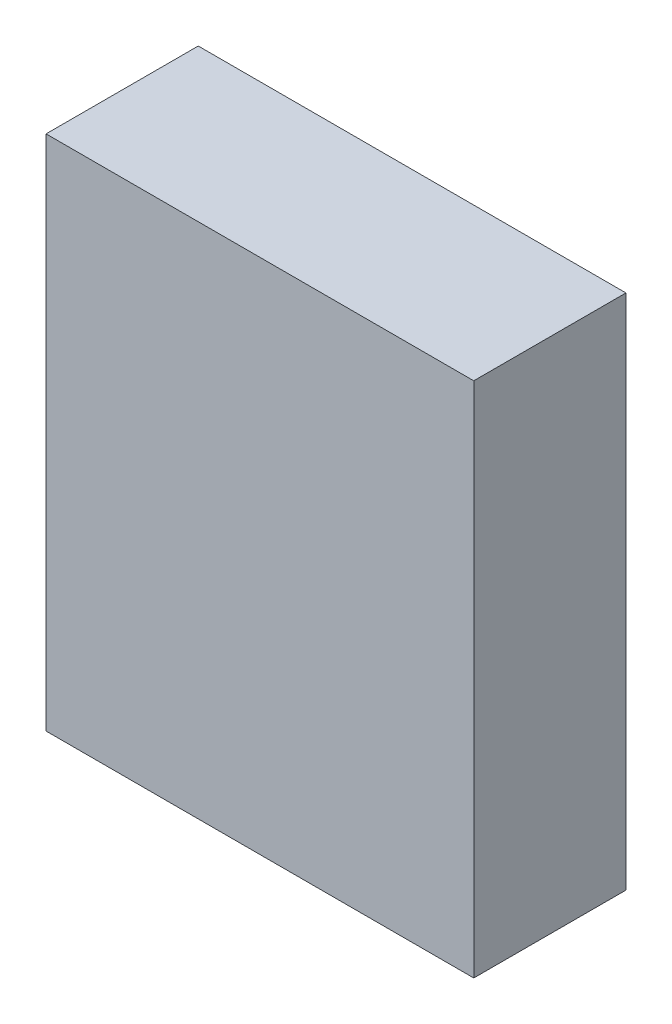
ISO-10303-21;
HEADER;
FILE_DESCRIPTION(('STEP AP214'),'2;1');
FILE_NAME('part.step','',(''),(''),'','','');
FILE_SCHEMA(('AUTOMOTIVE_DESIGN { 1 0 10303 214 1 1 1 1 }'));
ENDSEC;
DATA;
#1=APPLICATION_CONTEXT('core data for automotive mechanical design processes');
#2=APPLICATION_PROTOCOL_DEFINITION('international standard','automotive_design',2000,#1);
#3=PRODUCT_CONTEXT('',#1,'mechanical');
#4=PRODUCT('Part','Part','',(#3));
#5=PRODUCT_RELATED_PRODUCT_CATEGORY('part','',(#4));
#6=PRODUCT_DEFINITION_FORMATION('','',#4);
#7=PRODUCT_DEFINITION_CONTEXT('part definition',#1,'design');
#8=PRODUCT_DEFINITION('design','',#6,#7);
#9=PRODUCT_DEFINITION_SHAPE('','',#8);
#10=(LENGTH_UNIT() NAMED_UNIT(*) SI_UNIT(.MILLI.,.METRE.));
#11=(NAMED_UNIT(*) PLANE_ANGLE_UNIT() SI_UNIT($,.RADIAN.));
#12=(NAMED_UNIT(*) SI_UNIT($,.STERADIAN.) SOLID_ANGLE_UNIT());
#13=UNCERTAINTY_MEASURE_WITH_UNIT(LENGTH_MEASURE(1.E-05),#10,'distance_accuracy_value','');
#14=(GEOMETRIC_REPRESENTATION_CONTEXT(3) GLOBAL_UNCERTAINTY_ASSIGNED_CONTEXT((#13)) GLOBAL_UNIT_ASSIGNED_CONTEXT((#10,
#11,#12)) REPRESENTATION_CONTEXT('',''));
#15=CARTESIAN_POINT('',(0.,0.,0.));
#16=DIRECTION('',(0.,0.,1.));
#17=DIRECTION('',(1.,0.,0.));
#18=AXIS2_PLACEMENT_3D('',#15,#16,#17);
#19=CARTESIAN_POINT('',(0.75,-3.235,1.7));
#20=DIRECTION('',(0.,0.,1.));
#21=DIRECTION('',(1.,0.,0.));
#22=AXIS2_PLACEMENT_3D('',#19,#20,#21);
#23=PLANE('',#22);
#24=DIRECTION('',(0.,1.,0.));
#25=VECTOR('',#24,1.);
#26=CARTESIAN_POINT('',(5.05,-3.235,1.7));
#27=LINE('',#26,#25);
#28=CARTESIAN_POINT('',(5.05,1.965,1.7));
#29=VERTEX_POINT('',#28);
#30=CARTESIAN_POINT('',(5.05,-3.235,1.7));
#31=VERTEX_POINT('',#30);
#32=EDGE_CURVE('E75',#29,#31,#27,.F.);
#33=ORIENTED_EDGE('',*,*,#32,.F.);
#34=DIRECTION('',(1.,0.,0.));
#35=VECTOR('',#34,1.);
#36=CARTESIAN_POINT('',(0.75,1.965,1.7));
#37=LINE('',#36,#35);
#38=CARTESIAN_POINT('',(0.75,1.965,1.7));
#39=VERTEX_POINT('',#38);
#40=EDGE_CURVE('E57',#39,#29,#37,.T.);
#41=ORIENTED_EDGE('',*,*,#40,.F.);
#42=DIRECTION('',(0.,1.,0.));
#43=VECTOR('',#42,1.);
#44=CARTESIAN_POINT('',(0.75,-3.235,1.7));
#45=LINE('',#44,#43);
#46=CARTESIAN_POINT('',(0.75,-3.235,1.7));
#47=VERTEX_POINT('',#46);
#48=EDGE_CURVE('E19',#39,#47,#45,.F.);
#49=ORIENTED_EDGE('',*,*,#48,.T.);
#50=DIRECTION('',(1.,0.,0.));
#51=VECTOR('',#50,1.);
#52=CARTESIAN_POINT('',(0.75,-3.235,1.7));
#53=LINE('',#52,#51);
#54=EDGE_CURVE('E54',#47,#31,#53,.T.);
#55=ORIENTED_EDGE('',*,*,#54,.T.);
#56=EDGE_LOOP('',(#33,#41,#49,#55));
#57=FACE_BOUND('',#56,.T.);
#58=ADVANCED_FACE('F16',(#57),#23,.T.);
#59=CARTESIAN_POINT('',(0.75,-3.235,0.17));
#60=DIRECTION('',(1.,0.,0.));
#61=DIRECTION('',(0.,0.,-1.));
#62=AXIS2_PLACEMENT_3D('',#59,#60,#61);
#63=PLANE('',#62);
#64=DIRECTION('',(0.,0.,1.));
#65=VECTOR('',#64,1.);
#66=CARTESIAN_POINT('',(0.75,1.965,0.17));
#67=LINE('',#66,#65);
#68=CARTESIAN_POINT('',(0.75,1.965,0.17));
#69=VERTEX_POINT('',#68);
#70=EDGE_CURVE('E77',#69,#39,#67,.T.);
#71=ORIENTED_EDGE('',*,*,#70,.F.);
#72=DIRECTION('',(0.,1.,0.));
#73=VECTOR('',#72,1.);
#74=CARTESIAN_POINT('',(0.75,-3.235,0.17));
#75=LINE('',#74,#73);
#76=CARTESIAN_POINT('',(0.75,-3.235,0.17));
#77=VERTEX_POINT('',#76);
#78=EDGE_CURVE('E72',#69,#77,#75,.F.);
#79=ORIENTED_EDGE('',*,*,#78,.T.);
#80=DIRECTION('',(0.,0.,1.));
#81=VECTOR('',#80,1.);
#82=CARTESIAN_POINT('',(0.75,-3.235,0.17));
#83=LINE('',#82,#81);
#84=EDGE_CURVE('E62',#77,#47,#83,.T.);
#85=ORIENTED_EDGE('',*,*,#84,.T.);
#86=ORIENTED_EDGE('',*,*,#48,.F.);
#87=EDGE_LOOP('',(#71,#79,#85,#86));
#88=FACE_BOUND('',#87,.T.);
#89=ADVANCED_FACE('F71',(#88),#63,.F.);
#90=CARTESIAN_POINT('',(0.75,-3.235,0.17));
#91=DIRECTION('',(0.,1.,0.));
#92=DIRECTION('',(0.,0.,1.));
#93=AXIS2_PLACEMENT_3D('',#90,#91,#92);
#94=PLANE('',#93);
#95=ORIENTED_EDGE('',*,*,#54,.F.);
#96=ORIENTED_EDGE('',*,*,#84,.F.);
#97=DIRECTION('',(1.,0.,0.));
#98=VECTOR('',#97,1.);
#99=CARTESIAN_POINT('',(0.75,-3.235,0.17));
#100=LINE('',#99,#98);
#101=CARTESIAN_POINT('',(5.05,-3.235,0.17));
#102=VERTEX_POINT('',#101);
#103=EDGE_CURVE('E82',#77,#102,#100,.T.);
#104=ORIENTED_EDGE('',*,*,#103,.T.);
#105=DIRECTION('',(0.,0.,-1.));
#106=VECTOR('',#105,1.);
#107=CARTESIAN_POINT('',(5.05,-3.235,0.17));
#108=LINE('',#107,#106);
#109=EDGE_CURVE('E68',#31,#102,#108,.T.);
#110=ORIENTED_EDGE('',*,*,#109,.F.);
#111=EDGE_LOOP('',(#95,#96,#104,#110));
#112=FACE_BOUND('',#111,.T.);
#113=ADVANCED_FACE('F65',(#112),#94,.F.);
#114=CARTESIAN_POINT('',(5.05,-3.235,0.17));
#115=DIRECTION('',(1.,0.,0.));
#116=DIRECTION('',(0.,0.,-1.));
#117=AXIS2_PLACEMENT_3D('',#114,#115,#116);
#118=PLANE('',#117);
#119=DIRECTION('',(0.,0.,1.));
#120=VECTOR('',#119,1.);
#121=CARTESIAN_POINT('',(5.05,1.965,0.17));
#122=LINE('',#121,#120);
#123=CARTESIAN_POINT('',(5.05,1.965,0.17));
#124=VERTEX_POINT('',#123);
#125=EDGE_CURVE('E33',#29,#124,#122,.F.);
#126=ORIENTED_EDGE('',*,*,#125,.F.);
#127=ORIENTED_EDGE('',*,*,#32,.T.);
#128=ORIENTED_EDGE('',*,*,#109,.T.);
#129=DIRECTION('',(0.,1.,0.));
#130=VECTOR('',#129,1.);
#131=CARTESIAN_POINT('',(5.05,-3.235,0.17));
#132=LINE('',#131,#130);
#133=EDGE_CURVE('E25',#102,#124,#132,.T.);
#134=ORIENTED_EDGE('',*,*,#133,.T.);
#135=EDGE_LOOP('',(#126,#127,#128,#134));
#136=FACE_BOUND('',#135,.T.);
#137=ADVANCED_FACE('F87',(#136),#118,.T.);
#138=CARTESIAN_POINT('',(0.75,1.965,0.17));
#139=DIRECTION('',(0.,1.,0.));
#140=DIRECTION('',(0.,0.,1.));
#141=AXIS2_PLACEMENT_3D('',#138,#139,#140);
#142=PLANE('',#141);
#143=ORIENTED_EDGE('',*,*,#40,.T.);
#144=ORIENTED_EDGE('',*,*,#125,.T.);
#145=DIRECTION('',(1.,0.,0.));
#146=VECTOR('',#145,1.);
#147=CARTESIAN_POINT('',(0.75,1.965,0.17));
#148=LINE('',#147,#146);
#149=EDGE_CURVE('E11',#124,#69,#148,.F.);
#150=ORIENTED_EDGE('',*,*,#149,.T.);
#151=ORIENTED_EDGE('',*,*,#70,.T.);
#152=EDGE_LOOP('',(#143,#144,#150,#151));
#153=FACE_BOUND('',#152,.T.);
#154=ADVANCED_FACE('F90',(#153),#142,.T.);
#155=CARTESIAN_POINT('',(0.75,-3.235,0.17));
#156=DIRECTION('',(0.,0.,1.));
#157=DIRECTION('',(1.,0.,0.));
#158=AXIS2_PLACEMENT_3D('',#155,#156,#157);
#159=PLANE('',#158);
#160=ORIENTED_EDGE('',*,*,#133,.F.);
#161=ORIENTED_EDGE('',*,*,#103,.F.);
#162=ORIENTED_EDGE('',*,*,#78,.F.);
#163=ORIENTED_EDGE('',*,*,#149,.F.);
#164=EDGE_LOOP('',(#160,#161,#162,#163));
#165=FACE_BOUND('',#164,.T.);
#166=ADVANCED_FACE('F89',(#165),#159,.F.);
#167=CLOSED_SHELL('',(#58,#89,#113,#137,#154,#166));
#168=MANIFOLD_SOLID_BREP('B1',#167);
#169=ADVANCED_BREP_SHAPE_REPRESENTATION('',(#18,#168),#14);
#170=SHAPE_DEFINITION_REPRESENTATION(#9,#169);
ENDSEC;
END-ISO-10303-21;
